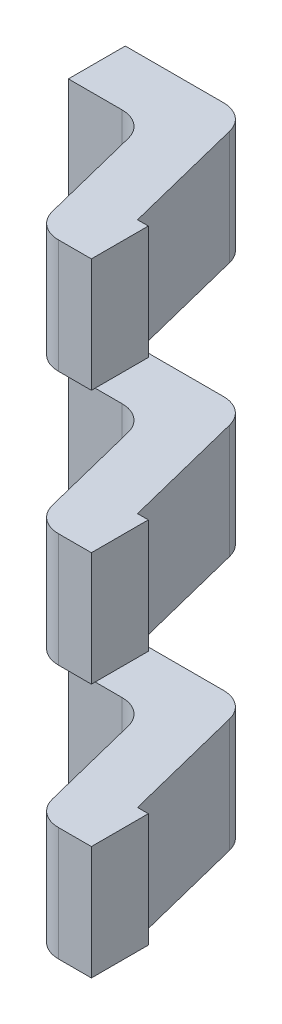
ISO-10303-21;
HEADER;
FILE_DESCRIPTION(('STEP AP214'),'2;1');
FILE_NAME('part.step','',(''),(''),'','','');
FILE_SCHEMA(('AUTOMOTIVE_DESIGN { 1 0 10303 214 1 1 1 1 }'));
ENDSEC;
DATA;
#1=APPLICATION_CONTEXT('core data for automotive mechanical design processes');
#2=APPLICATION_PROTOCOL_DEFINITION('international standard','automotive_design',2000,#1);
#3=PRODUCT_CONTEXT('',#1,'mechanical');
#4=PRODUCT('Part','Part','',(#3));
#5=PRODUCT_RELATED_PRODUCT_CATEGORY('part','',(#4));
#6=PRODUCT_DEFINITION_FORMATION('','',#4);
#7=PRODUCT_DEFINITION_CONTEXT('part definition',#1,'design');
#8=PRODUCT_DEFINITION('design','',#6,#7);
#9=PRODUCT_DEFINITION_SHAPE('','',#8);
#10=(LENGTH_UNIT() NAMED_UNIT(*) SI_UNIT(.MILLI.,.METRE.));
#11=(NAMED_UNIT(*) PLANE_ANGLE_UNIT() SI_UNIT($,.RADIAN.));
#12=(NAMED_UNIT(*) SI_UNIT($,.STERADIAN.) SOLID_ANGLE_UNIT());
#13=UNCERTAINTY_MEASURE_WITH_UNIT(LENGTH_MEASURE(1.E-05),#10,'distance_accuracy_value','');
#14=(GEOMETRIC_REPRESENTATION_CONTEXT(3) GLOBAL_UNCERTAINTY_ASSIGNED_CONTEXT((#13)) GLOBAL_UNIT_ASSIGNED_CONTEXT((#10,
#11,#12)) REPRESENTATION_CONTEXT('',''));
#15=CARTESIAN_POINT('',(0.,0.,0.));
#16=DIRECTION('',(0.,0.,1.));
#17=DIRECTION('',(1.,0.,0.));
#18=AXIS2_PLACEMENT_3D('',#15,#16,#17);
#19=CARTESIAN_POINT('',(-1.071722354756,0.2125,0.323542364223));
#20=DIRECTION('',(0.,1.,0.));
#21=DIRECTION('',(-1.,0.,0.));
#22=AXIS2_PLACEMENT_3D('',#19,#20,#21);
#23=PLANE('',#22);
#24=DIRECTION('',(-0.242535625036098,0.,-0.970142500145391));
#25=VECTOR('',#24,1.);
#26=CARTESIAN_POINT('',(-0.975,0.2125,0.));
#27=LINE('',#26,#25);
#28=CARTESIAN_POINT('',(-0.954879852540029,0.2125,0.0804805898399656));
#29=VERTEX_POINT('',#28);
#30=CARTESIAN_POINT('',(-0.840240294920043,0.2125,0.539038820320011));
#31=VERTEX_POINT('',#30);
#32=EDGE_CURVE('P0_E111',#29,#31,#27,.F.);
#33=ORIENTED_EDGE('',*,*,#32,.F.);
#34=CARTESIAN_POINT('',(-1.05795749318,0.2125,0.10625));
#35=DIRECTION('',(0.,1.,0.));
#36=DIRECTION('',(0.,0.,1.));
#37=AXIS2_PLACEMENT_3D('',#34,#35,#36);
#38=CIRCLE('',#37,0.10625);
#39=CARTESIAN_POINT('',(-1.05795749318,0.2125,0.));
#40=VERTEX_POINT('',#39);
#41=EDGE_CURVE('P0_E20',#40,#29,#38,.F.);
#42=ORIENTED_EDGE('',*,*,#41,.F.);
#43=DIRECTION('',(1.,0.,0.));
#44=VECTOR('',#43,1.);
#45=CARTESIAN_POINT('',(-1.425,0.2125,0.));
#46=LINE('',#45,#44);
#47=CARTESIAN_POINT('',(-1.425,0.2125,0.));
#48=VERTEX_POINT('',#47);
#49=EDGE_CURVE('P0_E97',#40,#48,#46,.F.);
#50=ORIENTED_EDGE('',*,*,#49,.T.);
#51=DIRECTION('',(0.,0.,-1.));
#52=VECTOR('',#51,1.);
#53=CARTESIAN_POINT('',(-1.425,0.2125,0.));
#54=LINE('',#53,#52);
#55=CARTESIAN_POINT('',(-1.425,0.2125,0.2125));
#56=VERTEX_POINT('',#55);
#57=EDGE_CURVE('P0_E129',#48,#56,#54,.F.);
#58=ORIENTED_EDGE('',*,*,#57,.T.);
#59=DIRECTION('',(1.,0.,0.));
#60=VECTOR('',#59,1.);
#61=CARTESIAN_POINT('',(-1.425,0.2125,0.2125));
#62=LINE('',#61,#60);
#63=CARTESIAN_POINT('',(-1.223872479541,0.2125,0.2125));
#64=VERTEX_POINT('',#63);
#65=EDGE_CURVE('P0_E133',#64,#56,#62,.F.);
#66=ORIENTED_EDGE('',*,*,#65,.F.);
#67=CARTESIAN_POINT('',(-1.223872479541,0.2125,0.31875));
#68=DIRECTION('',(0.,1.,0.));
#69=DIRECTION('',(0.,0.,1.));
#70=AXIS2_PLACEMENT_3D('',#67,#68,#69);
#71=CIRCLE('',#70,0.10625);
#72=CARTESIAN_POINT('',(-1.12079483890083,0.2125,0.292980589839971));
#73=VERTEX_POINT('',#72);
#74=EDGE_CURVE('P0_E176',#64,#73,#71,.F.);
#75=ORIENTED_EDGE('',*,*,#74,.T.);
#76=DIRECTION('',(-0.242535625036098,0.,-0.970142500145391));
#77=VECTOR('',#76,1.);
#78=CARTESIAN_POINT('',(-1.181155281281,0.2125,0.05153882032022));
#79=LINE('',#78,#77);
#80=CARTESIAN_POINT('',(-1.02627542874118,0.2125,0.671058230480156));
#81=VERTEX_POINT('',#80);
#82=EDGE_CURVE('P0_E144',#73,#81,#79,.F.);
#83=ORIENTED_EDGE('',*,*,#82,.T.);
#84=CARTESIAN_POINT('',(-0.9231977881,0.2125,0.64528882032));
#85=DIRECTION('',(0.,1.,0.));
#86=DIRECTION('',(0.,0.,1.));
#87=AXIS2_PLACEMENT_3D('',#84,#85,#86);
#88=CIRCLE('',#87,0.10625);
#89=CARTESIAN_POINT('',(-0.9231977881,0.2125,0.75153882032));
#90=VERTEX_POINT('',#89);
#91=EDGE_CURVE('P0_E147',#90,#81,#88,.F.);
#92=ORIENTED_EDGE('',*,*,#91,.F.);
#93=DIRECTION('',(1.,0.,0.));
#94=VECTOR('',#93,1.);
#95=CARTESIAN_POINT('',(-1.006155281281,0.2125,0.75153882032));
#96=LINE('',#95,#94);
#97=CARTESIAN_POINT('',(-0.8,0.2125,0.75153882032));
#98=VERTEX_POINT('',#97);
#99=EDGE_CURVE('P0_E148',#98,#90,#96,.F.);
#100=ORIENTED_EDGE('',*,*,#99,.F.);
#101=DIRECTION('',(0.,0.,-1.));
#102=VECTOR('',#101,1.);
#103=CARTESIAN_POINT('',(-0.8,0.2125,0.53903882032));
#104=LINE('',#103,#102);
#105=CARTESIAN_POINT('',(-0.8,0.2125,0.53903882032));
#106=VERTEX_POINT('',#105);
#107=EDGE_CURVE('P0_E154',#106,#98,#104,.F.);
#108=ORIENTED_EDGE('',*,*,#107,.F.);
#109=DIRECTION('',(1.,0.,0.));
#110=VECTOR('',#109,1.);
#111=CARTESIAN_POINT('',(-1.006155281281,0.2125,0.53903882032));
#112=LINE('',#111,#110);
#113=EDGE_CURVE('P0_E113',#106,#31,#112,.F.);
#114=ORIENTED_EDGE('',*,*,#113,.T.);
#115=EDGE_LOOP('',(#33,#42,#50,#58,#66,#75,#83,#92,#100,#108,#114));
#116=FACE_BOUND('',#115,.T.);
#117=ADVANCED_FACE('P0_F17',(#116),#23,.T.);
#118=CARTESIAN_POINT('',(-1.425,-0.2125,0.));
#119=DIRECTION('',(0.,0.,1.));
#120=DIRECTION('',(1.,0.,0.));
#121=AXIS2_PLACEMENT_3D('',#118,#119,#120);
#122=PLANE('',#121);
#123=DIRECTION('',(1.,0.,0.));
#124=VECTOR('',#123,1.);
#125=CARTESIAN_POINT('',(-1.071722354756,-0.2125,0.));
#126=LINE('',#125,#124);
#127=CARTESIAN_POINT('',(-1.425,-0.2125,0.));
#128=VERTEX_POINT('',#127);
#129=CARTESIAN_POINT('',(-1.05795749318,-0.2125,0.));
#130=VERTEX_POINT('',#129);
#131=EDGE_CURVE('P0_E175',#128,#130,#126,.T.);
#132=ORIENTED_EDGE('',*,*,#131,.F.);
#133=DIRECTION('',(0.,1.,0.));
#134=VECTOR('',#133,1.);
#135=CARTESIAN_POINT('',(-1.425,-0.2125,0.));
#136=LINE('',#135,#134);
#137=EDGE_CURVE('P0_E127',#128,#48,#136,.T.);
#138=ORIENTED_EDGE('',*,*,#137,.T.);
#139=ORIENTED_EDGE('',*,*,#49,.F.);
#140=DIRECTION('',(0.,1.,0.));
#141=VECTOR('',#140,1.);
#142=CARTESIAN_POINT('',(-1.05795749318,-0.2125,0.));
#143=LINE('',#142,#141);
#144=EDGE_CURVE('P0_E108',#130,#40,#143,.T.);
#145=ORIENTED_EDGE('',*,*,#144,.F.);
#146=EDGE_LOOP('',(#132,#138,#139,#145));
#147=FACE_BOUND('',#146,.T.);
#148=ADVANCED_FACE('P0_F343',(#147),#122,.F.);
#149=CARTESIAN_POINT('',(-1.05795749318,-0.2125,0.10625));
#150=DIRECTION('',(0.,1.,0.));
#151=DIRECTION('',(0.,0.,1.));
#152=AXIS2_PLACEMENT_3D('',#149,#150,#151);
#153=CYLINDRICAL_SURFACE('',#152,0.10625);
#154=DIRECTION('',(0.,1.,0.));
#155=VECTOR('',#154,1.);
#156=CARTESIAN_POINT('',(-0.954879852540045,-0.2125,0.0804805898399013));
#157=LINE('',#156,#155);
#158=CARTESIAN_POINT('',(-0.954879852540009,-0.2125,0.0804805898399503));
#159=VERTEX_POINT('',#158);
#160=EDGE_CURVE('P0_E106',#159,#29,#157,.T.);
#161=ORIENTED_EDGE('',*,*,#160,.F.);
#162=CARTESIAN_POINT('',(-1.05795749318,-0.2125,0.10625));
#163=DIRECTION('',(0.,1.,0.));
#164=DIRECTION('',(0.,0.,1.));
#165=AXIS2_PLACEMENT_3D('',#162,#163,#164);
#166=CIRCLE('',#165,0.10625);
#167=EDGE_CURVE('P0_E173',#130,#159,#166,.F.);
#168=ORIENTED_EDGE('',*,*,#167,.F.);
#169=ORIENTED_EDGE('',*,*,#144,.T.);
#170=ORIENTED_EDGE('',*,*,#41,.T.);
#171=EDGE_LOOP('',(#161,#168,#169,#170));
#172=FACE_BOUND('',#171,.T.);
#173=ADVANCED_FACE('P0_F103',(#172),#153,.T.);
#174=CARTESIAN_POINT('',(-0.975,-0.2125,0.));
#175=DIRECTION('',(0.970142500145391,0.,-0.242535625036098));
#176=DIRECTION('',(-0.242535625036098,0.,-0.970142500145391));
#177=AXIS2_PLACEMENT_3D('',#174,#175,#176);
#178=PLANE('',#177);
#179=ORIENTED_EDGE('',*,*,#32,.T.);
#180=DIRECTION('',(0.,1.,0.));
#181=VECTOR('',#180,1.);
#182=CARTESIAN_POINT('',(-0.84024029492,-0.2125,0.53903882032));
#183=LINE('',#182,#181);
#184=CARTESIAN_POINT('',(-0.84024029492,-0.2125,0.53903882032));
#185=VERTEX_POINT('',#184);
#186=EDGE_CURVE('P0_E160',#31,#185,#183,.F.);
#187=ORIENTED_EDGE('',*,*,#186,.T.);
#188=DIRECTION('',(0.242535625036278,0.,0.970142500145346));
#189=VECTOR('',#188,1.);
#190=CARTESIAN_POINT('',(-0.95487985254,-0.2125,0.08048058983989));
#191=LINE('',#190,#189);
#192=EDGE_CURVE('P0_E119',#159,#185,#191,.T.);
#193=ORIENTED_EDGE('',*,*,#192,.F.);
#194=ORIENTED_EDGE('',*,*,#160,.T.);
#195=EDGE_LOOP('',(#179,#187,#193,#194));
#196=FACE_BOUND('',#195,.T.);
#197=ADVANCED_FACE('P0_F117',(#196),#178,.T.);
#198=CARTESIAN_POINT('',(-1.006155281281,-0.2125,0.53903882032));
#199=DIRECTION('',(0.,0.,1.));
#200=DIRECTION('',(1.,0.,0.));
#201=AXIS2_PLACEMENT_3D('',#198,#199,#200);
#202=PLANE('',#201);
#203=DIRECTION('',(1.,0.,0.));
#204=VECTOR('',#203,1.);
#205=CARTESIAN_POINT('',(-1.071722354756,-0.2125,0.53903882032));
#206=LINE('',#205,#204);
#207=CARTESIAN_POINT('',(-0.8,-0.2125,0.53903882032));
#208=VERTEX_POINT('',#207);
#209=EDGE_CURVE('P0_E194',#185,#208,#206,.T.);
#210=ORIENTED_EDGE('',*,*,#209,.F.);
#211=ORIENTED_EDGE('',*,*,#186,.F.);
#212=ORIENTED_EDGE('',*,*,#113,.F.);
#213=DIRECTION('',(0.,1.,0.));
#214=VECTOR('',#213,1.);
#215=CARTESIAN_POINT('',(-0.8,-0.2125,0.53903882032));
#216=LINE('',#215,#214);
#217=EDGE_CURVE('P0_E156',#208,#106,#216,.T.);
#218=ORIENTED_EDGE('',*,*,#217,.F.);
#219=EDGE_LOOP('',(#210,#211,#212,#218));
#220=FACE_BOUND('',#219,.T.);
#221=ADVANCED_FACE('P0_F206',(#220),#202,.F.);
#222=CARTESIAN_POINT('',(-0.8,-0.2125,0.53903882032));
#223=DIRECTION('',(1.,0.,0.));
#224=DIRECTION('',(0.,0.,-1.));
#225=AXIS2_PLACEMENT_3D('',#222,#223,#224);
#226=PLANE('',#225);
#227=ORIENTED_EDGE('',*,*,#107,.T.);
#228=DIRECTION('',(0.,1.,0.));
#229=VECTOR('',#228,1.);
#230=CARTESIAN_POINT('',(-0.8,-0.2125,0.75153882032));
#231=LINE('',#230,#229);
#232=CARTESIAN_POINT('',(-0.8,-0.2125,0.75153882032));
#233=VERTEX_POINT('',#232);
#234=EDGE_CURVE('P0_E151',#233,#98,#231,.T.);
#235=ORIENTED_EDGE('',*,*,#234,.F.);
#236=DIRECTION('',(0.,0.,-1.));
#237=VECTOR('',#236,1.);
#238=CARTESIAN_POINT('',(-0.8,-0.2125,0.323542364223));
#239=LINE('',#238,#237);
#240=EDGE_CURVE('P0_E191',#208,#233,#239,.F.);
#241=ORIENTED_EDGE('',*,*,#240,.F.);
#242=ORIENTED_EDGE('',*,*,#217,.T.);
#243=EDGE_LOOP('',(#227,#235,#241,#242));
#244=FACE_BOUND('',#243,.T.);
#245=ADVANCED_FACE('P0_F256',(#244),#226,.T.);
#246=CARTESIAN_POINT('',(-1.006155281281,-0.2125,0.75153882032));
#247=DIRECTION('',(0.,0.,1.));
#248=DIRECTION('',(1.,0.,0.));
#249=AXIS2_PLACEMENT_3D('',#246,#247,#248);
#250=PLANE('',#249);
#251=ORIENTED_EDGE('',*,*,#99,.T.);
#252=DIRECTION('',(0.,1.,0.));
#253=VECTOR('',#252,1.);
#254=CARTESIAN_POINT('',(-0.9231977881,-0.2125,0.75153882032));
#255=LINE('',#254,#253);
#256=CARTESIAN_POINT('',(-0.9231977881,-0.2125,0.75153882032));
#257=VERTEX_POINT('',#256);
#258=EDGE_CURVE('P0_E150',#257,#90,#255,.T.);
#259=ORIENTED_EDGE('',*,*,#258,.F.);
#260=DIRECTION('',(1.,0.,0.));
#261=VECTOR('',#260,1.);
#262=CARTESIAN_POINT('',(-1.071722354756,-0.2125,0.75153882032));
#263=LINE('',#262,#261);
#264=EDGE_CURVE('P0_E172',#233,#257,#263,.F.);
#265=ORIENTED_EDGE('',*,*,#264,.F.);
#266=ORIENTED_EDGE('',*,*,#234,.T.);
#267=EDGE_LOOP('',(#251,#259,#265,#266));
#268=FACE_BOUND('',#267,.T.);
#269=ADVANCED_FACE('P0_F245',(#268),#250,.T.);
#270=CARTESIAN_POINT('',(-0.9231977881,-0.2125,0.64528882032));
#271=DIRECTION('',(0.,1.,0.));
#272=DIRECTION('',(0.,0.,1.));
#273=AXIS2_PLACEMENT_3D('',#270,#271,#272);
#274=CYLINDRICAL_SURFACE('',#273,0.10625);
#275=ORIENTED_EDGE('',*,*,#91,.T.);
#276=DIRECTION('',(0.,1.,0.));
#277=VECTOR('',#276,1.);
#278=CARTESIAN_POINT('',(-1.0262754287412,-0.2125,0.671058230480051));
#279=LINE('',#278,#277);
#280=CARTESIAN_POINT('',(-1.02627542874107,-0.2125,0.671058230480143));
#281=VERTEX_POINT('',#280);
#282=EDGE_CURVE('P0_E146',#81,#281,#279,.F.);
#283=ORIENTED_EDGE('',*,*,#282,.T.);
#284=CARTESIAN_POINT('',(-0.9231977881,-0.2125,0.64528882032));
#285=DIRECTION('',(0.,1.,0.));
#286=DIRECTION('',(0.,0.,1.));
#287=AXIS2_PLACEMENT_3D('',#284,#285,#286);
#288=CIRCLE('',#287,0.10625);
#289=EDGE_CURVE('P0_E169',#257,#281,#288,.F.);
#290=ORIENTED_EDGE('',*,*,#289,.F.);
#291=ORIENTED_EDGE('',*,*,#258,.T.);
#292=EDGE_LOOP('',(#275,#283,#290,#291));
#293=FACE_BOUND('',#292,.T.);
#294=ADVANCED_FACE('P0_F247',(#293),#274,.T.);
#295=CARTESIAN_POINT('',(-1.181155281281,-0.2125,0.05153882032022));
#296=DIRECTION('',(0.970142500145391,0.,-0.242535625036098));
#297=DIRECTION('',(-0.242535625036098,0.,-0.970142500145391));
#298=AXIS2_PLACEMENT_3D('',#295,#296,#297);
#299=PLANE('',#298);
#300=ORIENTED_EDGE('',*,*,#82,.F.);
#301=DIRECTION('',(0.,1.,0.));
#302=VECTOR('',#301,1.);
#303=CARTESIAN_POINT('',(-1.12079483890056,-0.2125,0.29298058983989));
#304=LINE('',#303,#302);
#305=CARTESIAN_POINT('',(-1.12079483890078,-0.2125,0.292980589839945));
#306=VERTEX_POINT('',#305);
#307=EDGE_CURVE('P0_E135',#73,#306,#304,.F.);
#308=ORIENTED_EDGE('',*,*,#307,.T.);
#309=DIRECTION('',(-0.242535625036333,0.,-0.970142500145332));
#310=VECTOR('',#309,1.);
#311=CARTESIAN_POINT('',(-1.026275428741,-0.2125,0.67105823048));
#312=LINE('',#311,#310);
#313=EDGE_CURVE('P0_E168',#281,#306,#312,.T.);
#314=ORIENTED_EDGE('',*,*,#313,.F.);
#315=ORIENTED_EDGE('',*,*,#282,.F.);
#316=EDGE_LOOP('',(#300,#308,#314,#315));
#317=FACE_BOUND('',#316,.T.);
#318=ADVANCED_FACE('P0_F233',(#317),#299,.F.);
#319=CARTESIAN_POINT('',(-1.223872479541,-0.2125,0.31875));
#320=DIRECTION('',(0.,1.,0.));
#321=DIRECTION('',(0.,0.,1.));
#322=AXIS2_PLACEMENT_3D('',#319,#320,#321);
#323=CYLINDRICAL_SURFACE('',#322,0.10625);
#324=ORIENTED_EDGE('',*,*,#307,.F.);
#325=ORIENTED_EDGE('',*,*,#74,.F.);
#326=DIRECTION('',(0.,1.,0.));
#327=VECTOR('',#326,1.);
#328=CARTESIAN_POINT('',(-1.223872479541,-0.2125,0.2125));
#329=LINE('',#328,#327);
#330=CARTESIAN_POINT('',(-1.223872479541,-0.2125,0.2125));
#331=VERTEX_POINT('',#330);
#332=EDGE_CURVE('P0_E130',#331,#64,#329,.T.);
#333=ORIENTED_EDGE('',*,*,#332,.F.);
#334=CARTESIAN_POINT('',(-1.223872479541,-0.2125,0.31875));
#335=DIRECTION('',(0.,1.,0.));
#336=DIRECTION('',(0.,0.,1.));
#337=AXIS2_PLACEMENT_3D('',#334,#335,#336);
#338=CIRCLE('',#337,0.10625);
#339=EDGE_CURVE('P0_E165',#306,#331,#338,.T.);
#340=ORIENTED_EDGE('',*,*,#339,.F.);
#341=EDGE_LOOP('',(#324,#325,#333,#340));
#342=FACE_BOUND('',#341,.T.);
#343=ADVANCED_FACE('P0_F237',(#342),#323,.F.);
#344=CARTESIAN_POINT('',(-1.425,-0.2125,0.2125));
#345=DIRECTION('',(0.,0.,1.));
#346=DIRECTION('',(1.,0.,0.));
#347=AXIS2_PLACEMENT_3D('',#344,#345,#346);
#348=PLANE('',#347);
#349=DIRECTION('',(1.,0.,0.));
#350=VECTOR('',#349,1.);
#351=CARTESIAN_POINT('',(-1.071722354756,-0.2125,0.2125));
#352=LINE('',#351,#350);
#353=CARTESIAN_POINT('',(-1.425,-0.2125,0.2125));
#354=VERTEX_POINT('',#353);
#355=EDGE_CURVE('P0_E26',#331,#354,#352,.F.);
#356=ORIENTED_EDGE('',*,*,#355,.F.);
#357=ORIENTED_EDGE('',*,*,#332,.T.);
#358=ORIENTED_EDGE('',*,*,#65,.T.);
#359=DIRECTION('',(0.,1.,0.));
#360=VECTOR('',#359,1.);
#361=CARTESIAN_POINT('',(-1.425,-0.2125,0.2125));
#362=LINE('',#361,#360);
#363=EDGE_CURVE('P0_E35',#56,#354,#362,.F.);
#364=ORIENTED_EDGE('',*,*,#363,.T.);
#365=EDGE_LOOP('',(#356,#357,#358,#364));
#366=FACE_BOUND('',#365,.T.);
#367=ADVANCED_FACE('P0_F264',(#366),#348,.T.);
#368=CARTESIAN_POINT('',(-1.425,-0.2125,0.));
#369=DIRECTION('',(1.,0.,0.));
#370=DIRECTION('',(0.,0.,-1.));
#371=AXIS2_PLACEMENT_3D('',#368,#369,#370);
#372=PLANE('',#371);
#373=ORIENTED_EDGE('',*,*,#57,.F.);
#374=ORIENTED_EDGE('',*,*,#137,.F.);
#375=DIRECTION('',(0.,0.,-1.));
#376=VECTOR('',#375,1.);
#377=CARTESIAN_POINT('',(-1.425,-0.2125,0.323542364223));
#378=LINE('',#377,#376);
#379=EDGE_CURVE('P0_E11',#354,#128,#378,.T.);
#380=ORIENTED_EDGE('',*,*,#379,.F.);
#381=ORIENTED_EDGE('',*,*,#363,.F.);
#382=EDGE_LOOP('',(#373,#374,#380,#381));
#383=FACE_BOUND('',#382,.T.);
#384=ADVANCED_FACE('P0_F259',(#383),#372,.F.);
#385=CARTESIAN_POINT('',(-1.071722354756,-0.2125,0.323542364223));
#386=DIRECTION('',(0.,-1.,0.));
#387=DIRECTION('',(0.,0.,-1.));
#388=AXIS2_PLACEMENT_3D('',#385,#386,#387);
#389=PLANE('',#388);
#390=ORIENTED_EDGE('',*,*,#355,.T.);
#391=ORIENTED_EDGE('',*,*,#379,.T.);
#392=ORIENTED_EDGE('',*,*,#131,.T.);
#393=ORIENTED_EDGE('',*,*,#167,.T.);
#394=ORIENTED_EDGE('',*,*,#192,.T.);
#395=ORIENTED_EDGE('',*,*,#209,.T.);
#396=ORIENTED_EDGE('',*,*,#240,.T.);
#397=ORIENTED_EDGE('',*,*,#264,.T.);
#398=ORIENTED_EDGE('',*,*,#289,.T.);
#399=ORIENTED_EDGE('',*,*,#313,.T.);
#400=ORIENTED_EDGE('',*,*,#339,.T.);
#401=EDGE_LOOP('',(#390,#391,#392,#393,#394,#395,#396,#397,#398,#399,#400));
#402=FACE_BOUND('',#401,.T.);
#403=ADVANCED_FACE('P0_F210',(#402),#389,.T.);
#404=CLOSED_SHELL('',(#117,#148,#173,#197,#221,#245,#269,#294,#318,#343,#367,#384,#403));
#405=MANIFOLD_SOLID_BREP('P0_B1',#404);
#406=CARTESIAN_POINT('',(-1.071722354756,1.1625,0.323542364223));
#407=DIRECTION('',(0.,1.,0.));
#408=DIRECTION('',(-1.,0.,0.));
#409=AXIS2_PLACEMENT_3D('',#406,#407,#408);
#410=PLANE('',#409);
#411=DIRECTION('',(-0.242535625036098,0.,-0.970142500145391));
#412=VECTOR('',#411,1.);
#413=CARTESIAN_POINT('',(-0.975,1.1625,0.));
#414=LINE('',#413,#412);
#415=CARTESIAN_POINT('',(-0.954879852540029,1.1625,0.0804805898399656));
#416=VERTEX_POINT('',#415);
#417=CARTESIAN_POINT('',(-0.840240294920043,1.1625,0.539038820320011));
#418=VERTEX_POINT('',#417);
#419=EDGE_CURVE('P1_E111',#416,#418,#414,.F.);
#420=ORIENTED_EDGE('',*,*,#419,.F.);
#421=CARTESIAN_POINT('',(-1.05795749318,1.1625,0.10625));
#422=DIRECTION('',(0.,1.,0.));
#423=DIRECTION('',(0.,0.,1.));
#424=AXIS2_PLACEMENT_3D('',#421,#422,#423);
#425=CIRCLE('',#424,0.10625);
#426=CARTESIAN_POINT('',(-1.05795749318,1.1625,0.));
#427=VERTEX_POINT('',#426);
#428=EDGE_CURVE('P1_E20',#427,#416,#425,.F.);
#429=ORIENTED_EDGE('',*,*,#428,.F.);
#430=DIRECTION('',(1.,0.,0.));
#431=VECTOR('',#430,1.);
#432=CARTESIAN_POINT('',(-1.425,1.1625,0.));
#433=LINE('',#432,#431);
#434=CARTESIAN_POINT('',(-1.425,1.1625,0.));
#435=VERTEX_POINT('',#434);
#436=EDGE_CURVE('P1_E97',#427,#435,#433,.F.);
#437=ORIENTED_EDGE('',*,*,#436,.T.);
#438=DIRECTION('',(0.,0.,-1.));
#439=VECTOR('',#438,1.);
#440=CARTESIAN_POINT('',(-1.425,1.1625,0.));
#441=LINE('',#440,#439);
#442=CARTESIAN_POINT('',(-1.425,1.1625,0.2125));
#443=VERTEX_POINT('',#442);
#444=EDGE_CURVE('P1_E129',#435,#443,#441,.F.);
#445=ORIENTED_EDGE('',*,*,#444,.T.);
#446=DIRECTION('',(1.,0.,0.));
#447=VECTOR('',#446,1.);
#448=CARTESIAN_POINT('',(-1.425,1.1625,0.2125));
#449=LINE('',#448,#447);
#450=CARTESIAN_POINT('',(-1.223872479541,1.1625,0.2125));
#451=VERTEX_POINT('',#450);
#452=EDGE_CURVE('P1_E133',#451,#443,#449,.F.);
#453=ORIENTED_EDGE('',*,*,#452,.F.);
#454=CARTESIAN_POINT('',(-1.223872479541,1.1625,0.31875));
#455=DIRECTION('',(0.,1.,0.));
#456=DIRECTION('',(0.,0.,1.));
#457=AXIS2_PLACEMENT_3D('',#454,#455,#456);
#458=CIRCLE('',#457,0.10625);
#459=CARTESIAN_POINT('',(-1.12079483890083,1.1625,0.292980589839971));
#460=VERTEX_POINT('',#459);
#461=EDGE_CURVE('P1_E176',#451,#460,#458,.F.);
#462=ORIENTED_EDGE('',*,*,#461,.T.);
#463=DIRECTION('',(-0.242535625036098,0.,-0.970142500145391));
#464=VECTOR('',#463,1.);
#465=CARTESIAN_POINT('',(-1.181155281281,1.1625,0.05153882032022));
#466=LINE('',#465,#464);
#467=CARTESIAN_POINT('',(-1.02627542874118,1.1625,0.671058230480156));
#468=VERTEX_POINT('',#467);
#469=EDGE_CURVE('P1_E144',#460,#468,#466,.F.);
#470=ORIENTED_EDGE('',*,*,#469,.T.);
#471=CARTESIAN_POINT('',(-0.9231977881,1.1625,0.64528882032));
#472=DIRECTION('',(0.,1.,0.));
#473=DIRECTION('',(0.,0.,1.));
#474=AXIS2_PLACEMENT_3D('',#471,#472,#473);
#475=CIRCLE('',#474,0.10625);
#476=CARTESIAN_POINT('',(-0.9231977881,1.1625,0.75153882032));
#477=VERTEX_POINT('',#476);
#478=EDGE_CURVE('P1_E147',#477,#468,#475,.F.);
#479=ORIENTED_EDGE('',*,*,#478,.F.);
#480=DIRECTION('',(1.,0.,0.));
#481=VECTOR('',#480,1.);
#482=CARTESIAN_POINT('',(-1.006155281281,1.1625,0.75153882032));
#483=LINE('',#482,#481);
#484=CARTESIAN_POINT('',(-0.8,1.1625,0.75153882032));
#485=VERTEX_POINT('',#484);
#486=EDGE_CURVE('P1_E148',#485,#477,#483,.F.);
#487=ORIENTED_EDGE('',*,*,#486,.F.);
#488=DIRECTION('',(0.,0.,-1.));
#489=VECTOR('',#488,1.);
#490=CARTESIAN_POINT('',(-0.8,1.1625,0.53903882032));
#491=LINE('',#490,#489);
#492=CARTESIAN_POINT('',(-0.8,1.1625,0.53903882032));
#493=VERTEX_POINT('',#492);
#494=EDGE_CURVE('P1_E154',#493,#485,#491,.F.);
#495=ORIENTED_EDGE('',*,*,#494,.F.);
#496=DIRECTION('',(1.,0.,0.));
#497=VECTOR('',#496,1.);
#498=CARTESIAN_POINT('',(-1.006155281281,1.1625,0.53903882032));
#499=LINE('',#498,#497);
#500=EDGE_CURVE('P1_E113',#493,#418,#499,.F.);
#501=ORIENTED_EDGE('',*,*,#500,.T.);
#502=EDGE_LOOP('',(#420,#429,#437,#445,#453,#462,#470,#479,#487,#495,#501));
#503=FACE_BOUND('',#502,.T.);
#504=ADVANCED_FACE('P1_F17',(#503),#410,.T.);
#505=CARTESIAN_POINT('',(-1.425,0.7375,0.));
#506=DIRECTION('',(0.,0.,1.));
#507=DIRECTION('',(1.,0.,0.));
#508=AXIS2_PLACEMENT_3D('',#505,#506,#507);
#509=PLANE('',#508);
#510=DIRECTION('',(1.,0.,0.));
#511=VECTOR('',#510,1.);
#512=CARTESIAN_POINT('',(-1.071722354756,0.7375,0.));
#513=LINE('',#512,#511);
#514=CARTESIAN_POINT('',(-1.425,0.7375,0.));
#515=VERTEX_POINT('',#514);
#516=CARTESIAN_POINT('',(-1.05795749318,0.7375,0.));
#517=VERTEX_POINT('',#516);
#518=EDGE_CURVE('P1_E175',#515,#517,#513,.T.);
#519=ORIENTED_EDGE('',*,*,#518,.F.);
#520=DIRECTION('',(0.,1.,0.));
#521=VECTOR('',#520,1.);
#522=CARTESIAN_POINT('',(-1.425,0.7375,0.));
#523=LINE('',#522,#521);
#524=EDGE_CURVE('P1_E127',#515,#435,#523,.T.);
#525=ORIENTED_EDGE('',*,*,#524,.T.);
#526=ORIENTED_EDGE('',*,*,#436,.F.);
#527=DIRECTION('',(0.,1.,0.));
#528=VECTOR('',#527,1.);
#529=CARTESIAN_POINT('',(-1.05795749318,0.7375,0.));
#530=LINE('',#529,#528);
#531=EDGE_CURVE('P1_E108',#517,#427,#530,.T.);
#532=ORIENTED_EDGE('',*,*,#531,.F.);
#533=EDGE_LOOP('',(#519,#525,#526,#532));
#534=FACE_BOUND('',#533,.T.);
#535=ADVANCED_FACE('P1_F343',(#534),#509,.F.);
#536=CARTESIAN_POINT('',(-1.05795749318,0.7375,0.10625));
#537=DIRECTION('',(0.,1.,0.));
#538=DIRECTION('',(0.,0.,1.));
#539=AXIS2_PLACEMENT_3D('',#536,#537,#538);
#540=CYLINDRICAL_SURFACE('',#539,0.10625);
#541=DIRECTION('',(0.,1.,0.));
#542=VECTOR('',#541,1.);
#543=CARTESIAN_POINT('',(-0.954879852540045,0.7375,0.0804805898399013));
#544=LINE('',#543,#542);
#545=CARTESIAN_POINT('',(-0.954879852540009,0.7375,0.0804805898399503));
#546=VERTEX_POINT('',#545);
#547=EDGE_CURVE('P1_E106',#546,#416,#544,.T.);
#548=ORIENTED_EDGE('',*,*,#547,.F.);
#549=CARTESIAN_POINT('',(-1.05795749318,0.7375,0.10625));
#550=DIRECTION('',(0.,1.,0.));
#551=DIRECTION('',(0.,0.,1.));
#552=AXIS2_PLACEMENT_3D('',#549,#550,#551);
#553=CIRCLE('',#552,0.10625);
#554=EDGE_CURVE('P1_E173',#517,#546,#553,.F.);
#555=ORIENTED_EDGE('',*,*,#554,.F.);
#556=ORIENTED_EDGE('',*,*,#531,.T.);
#557=ORIENTED_EDGE('',*,*,#428,.T.);
#558=EDGE_LOOP('',(#548,#555,#556,#557));
#559=FACE_BOUND('',#558,.T.);
#560=ADVANCED_FACE('P1_F103',(#559),#540,.T.);
#561=CARTESIAN_POINT('',(-0.975,0.7375,0.));
#562=DIRECTION('',(0.970142500145391,0.,-0.242535625036098));
#563=DIRECTION('',(-0.242535625036098,0.,-0.970142500145391));
#564=AXIS2_PLACEMENT_3D('',#561,#562,#563);
#565=PLANE('',#564);
#566=ORIENTED_EDGE('',*,*,#419,.T.);
#567=DIRECTION('',(0.,1.,0.));
#568=VECTOR('',#567,1.);
#569=CARTESIAN_POINT('',(-0.84024029492,0.7375,0.53903882032));
#570=LINE('',#569,#568);
#571=CARTESIAN_POINT('',(-0.84024029492,0.7375,0.53903882032));
#572=VERTEX_POINT('',#571);
#573=EDGE_CURVE('P1_E160',#418,#572,#570,.F.);
#574=ORIENTED_EDGE('',*,*,#573,.T.);
#575=DIRECTION('',(0.242535625036278,0.,0.970142500145346));
#576=VECTOR('',#575,1.);
#577=CARTESIAN_POINT('',(-0.95487985254,0.7375,0.08048058983989));
#578=LINE('',#577,#576);
#579=EDGE_CURVE('P1_E119',#546,#572,#578,.T.);
#580=ORIENTED_EDGE('',*,*,#579,.F.);
#581=ORIENTED_EDGE('',*,*,#547,.T.);
#582=EDGE_LOOP('',(#566,#574,#580,#581));
#583=FACE_BOUND('',#582,.T.);
#584=ADVANCED_FACE('P1_F117',(#583),#565,.T.);
#585=CARTESIAN_POINT('',(-1.006155281281,0.7375,0.53903882032));
#586=DIRECTION('',(0.,0.,1.));
#587=DIRECTION('',(1.,0.,0.));
#588=AXIS2_PLACEMENT_3D('',#585,#586,#587);
#589=PLANE('',#588);
#590=DIRECTION('',(1.,0.,0.));
#591=VECTOR('',#590,1.);
#592=CARTESIAN_POINT('',(-1.071722354756,0.7375,0.53903882032));
#593=LINE('',#592,#591);
#594=CARTESIAN_POINT('',(-0.8,0.7375,0.53903882032));
#595=VERTEX_POINT('',#594);
#596=EDGE_CURVE('P1_E194',#572,#595,#593,.T.);
#597=ORIENTED_EDGE('',*,*,#596,.F.);
#598=ORIENTED_EDGE('',*,*,#573,.F.);
#599=ORIENTED_EDGE('',*,*,#500,.F.);
#600=DIRECTION('',(0.,1.,0.));
#601=VECTOR('',#600,1.);
#602=CARTESIAN_POINT('',(-0.8,0.7375,0.53903882032));
#603=LINE('',#602,#601);
#604=EDGE_CURVE('P1_E156',#595,#493,#603,.T.);
#605=ORIENTED_EDGE('',*,*,#604,.F.);
#606=EDGE_LOOP('',(#597,#598,#599,#605));
#607=FACE_BOUND('',#606,.T.);
#608=ADVANCED_FACE('P1_F206',(#607),#589,.F.);
#609=CARTESIAN_POINT('',(-0.8,0.7375,0.53903882032));
#610=DIRECTION('',(1.,0.,0.));
#611=DIRECTION('',(0.,0.,-1.));
#612=AXIS2_PLACEMENT_3D('',#609,#610,#611);
#613=PLANE('',#612);
#614=ORIENTED_EDGE('',*,*,#494,.T.);
#615=DIRECTION('',(0.,1.,0.));
#616=VECTOR('',#615,1.);
#617=CARTESIAN_POINT('',(-0.8,0.7375,0.75153882032));
#618=LINE('',#617,#616);
#619=CARTESIAN_POINT('',(-0.8,0.7375,0.75153882032));
#620=VERTEX_POINT('',#619);
#621=EDGE_CURVE('P1_E151',#620,#485,#618,.T.);
#622=ORIENTED_EDGE('',*,*,#621,.F.);
#623=DIRECTION('',(0.,0.,-1.));
#624=VECTOR('',#623,1.);
#625=CARTESIAN_POINT('',(-0.8,0.7375,0.323542364223));
#626=LINE('',#625,#624);
#627=EDGE_CURVE('P1_E191',#595,#620,#626,.F.);
#628=ORIENTED_EDGE('',*,*,#627,.F.);
#629=ORIENTED_EDGE('',*,*,#604,.T.);
#630=EDGE_LOOP('',(#614,#622,#628,#629));
#631=FACE_BOUND('',#630,.T.);
#632=ADVANCED_FACE('P1_F256',(#631),#613,.T.);
#633=CARTESIAN_POINT('',(-1.006155281281,0.7375,0.75153882032));
#634=DIRECTION('',(0.,0.,1.));
#635=DIRECTION('',(1.,0.,0.));
#636=AXIS2_PLACEMENT_3D('',#633,#634,#635);
#637=PLANE('',#636);
#638=ORIENTED_EDGE('',*,*,#486,.T.);
#639=DIRECTION('',(0.,1.,0.));
#640=VECTOR('',#639,1.);
#641=CARTESIAN_POINT('',(-0.9231977881,0.7375,0.75153882032));
#642=LINE('',#641,#640);
#643=CARTESIAN_POINT('',(-0.9231977881,0.7375,0.75153882032));
#644=VERTEX_POINT('',#643);
#645=EDGE_CURVE('P1_E150',#644,#477,#642,.T.);
#646=ORIENTED_EDGE('',*,*,#645,.F.);
#647=DIRECTION('',(1.,0.,0.));
#648=VECTOR('',#647,1.);
#649=CARTESIAN_POINT('',(-1.071722354756,0.7375,0.75153882032));
#650=LINE('',#649,#648);
#651=EDGE_CURVE('P1_E172',#620,#644,#650,.F.);
#652=ORIENTED_EDGE('',*,*,#651,.F.);
#653=ORIENTED_EDGE('',*,*,#621,.T.);
#654=EDGE_LOOP('',(#638,#646,#652,#653));
#655=FACE_BOUND('',#654,.T.);
#656=ADVANCED_FACE('P1_F245',(#655),#637,.T.);
#657=CARTESIAN_POINT('',(-0.9231977881,0.7375,0.64528882032));
#658=DIRECTION('',(0.,1.,0.));
#659=DIRECTION('',(0.,0.,1.));
#660=AXIS2_PLACEMENT_3D('',#657,#658,#659);
#661=CYLINDRICAL_SURFACE('',#660,0.10625);
#662=ORIENTED_EDGE('',*,*,#478,.T.);
#663=DIRECTION('',(0.,1.,0.));
#664=VECTOR('',#663,1.);
#665=CARTESIAN_POINT('',(-1.0262754287412,0.7375,0.671058230480051));
#666=LINE('',#665,#664);
#667=CARTESIAN_POINT('',(-1.02627542874107,0.7375,0.671058230480143));
#668=VERTEX_POINT('',#667);
#669=EDGE_CURVE('P1_E146',#468,#668,#666,.F.);
#670=ORIENTED_EDGE('',*,*,#669,.T.);
#671=CARTESIAN_POINT('',(-0.9231977881,0.7375,0.64528882032));
#672=DIRECTION('',(0.,1.,0.));
#673=DIRECTION('',(0.,0.,1.));
#674=AXIS2_PLACEMENT_3D('',#671,#672,#673);
#675=CIRCLE('',#674,0.10625);
#676=EDGE_CURVE('P1_E169',#644,#668,#675,.F.);
#677=ORIENTED_EDGE('',*,*,#676,.F.);
#678=ORIENTED_EDGE('',*,*,#645,.T.);
#679=EDGE_LOOP('',(#662,#670,#677,#678));
#680=FACE_BOUND('',#679,.T.);
#681=ADVANCED_FACE('P1_F247',(#680),#661,.T.);
#682=CARTESIAN_POINT('',(-1.181155281281,0.7375,0.05153882032022));
#683=DIRECTION('',(0.970142500145391,0.,-0.242535625036098));
#684=DIRECTION('',(-0.242535625036098,0.,-0.970142500145391));
#685=AXIS2_PLACEMENT_3D('',#682,#683,#684);
#686=PLANE('',#685);
#687=ORIENTED_EDGE('',*,*,#469,.F.);
#688=DIRECTION('',(0.,1.,0.));
#689=VECTOR('',#688,1.);
#690=CARTESIAN_POINT('',(-1.12079483890056,0.7375,0.29298058983989));
#691=LINE('',#690,#689);
#692=CARTESIAN_POINT('',(-1.12079483890078,0.7375,0.292980589839945));
#693=VERTEX_POINT('',#692);
#694=EDGE_CURVE('P1_E135',#460,#693,#691,.F.);
#695=ORIENTED_EDGE('',*,*,#694,.T.);
#696=DIRECTION('',(-0.242535625036333,0.,-0.970142500145332));
#697=VECTOR('',#696,1.);
#698=CARTESIAN_POINT('',(-1.026275428741,0.7375,0.67105823048));
#699=LINE('',#698,#697);
#700=EDGE_CURVE('P1_E168',#668,#693,#699,.T.);
#701=ORIENTED_EDGE('',*,*,#700,.F.);
#702=ORIENTED_EDGE('',*,*,#669,.F.);
#703=EDGE_LOOP('',(#687,#695,#701,#702));
#704=FACE_BOUND('',#703,.T.);
#705=ADVANCED_FACE('P1_F233',(#704),#686,.F.);
#706=CARTESIAN_POINT('',(-1.223872479541,0.7375,0.31875));
#707=DIRECTION('',(0.,1.,0.));
#708=DIRECTION('',(0.,0.,1.));
#709=AXIS2_PLACEMENT_3D('',#706,#707,#708);
#710=CYLINDRICAL_SURFACE('',#709,0.10625);
#711=ORIENTED_EDGE('',*,*,#694,.F.);
#712=ORIENTED_EDGE('',*,*,#461,.F.);
#713=DIRECTION('',(0.,1.,0.));
#714=VECTOR('',#713,1.);
#715=CARTESIAN_POINT('',(-1.223872479541,0.7375,0.2125));
#716=LINE('',#715,#714);
#717=CARTESIAN_POINT('',(-1.223872479541,0.7375,0.2125));
#718=VERTEX_POINT('',#717);
#719=EDGE_CURVE('P1_E130',#718,#451,#716,.T.);
#720=ORIENTED_EDGE('',*,*,#719,.F.);
#721=CARTESIAN_POINT('',(-1.223872479541,0.7375,0.31875));
#722=DIRECTION('',(0.,1.,0.));
#723=DIRECTION('',(0.,0.,1.));
#724=AXIS2_PLACEMENT_3D('',#721,#722,#723);
#725=CIRCLE('',#724,0.10625);
#726=EDGE_CURVE('P1_E165',#693,#718,#725,.T.);
#727=ORIENTED_EDGE('',*,*,#726,.F.);
#728=EDGE_LOOP('',(#711,#712,#720,#727));
#729=FACE_BOUND('',#728,.T.);
#730=ADVANCED_FACE('P1_F237',(#729),#710,.F.);
#731=CARTESIAN_POINT('',(-1.425,0.7375,0.2125));
#732=DIRECTION('',(0.,0.,1.));
#733=DIRECTION('',(1.,0.,0.));
#734=AXIS2_PLACEMENT_3D('',#731,#732,#733);
#735=PLANE('',#734);
#736=DIRECTION('',(1.,0.,0.));
#737=VECTOR('',#736,1.);
#738=CARTESIAN_POINT('',(-1.071722354756,0.7375,0.2125));
#739=LINE('',#738,#737);
#740=CARTESIAN_POINT('',(-1.425,0.7375,0.2125));
#741=VERTEX_POINT('',#740);
#742=EDGE_CURVE('P1_E26',#718,#741,#739,.F.);
#743=ORIENTED_EDGE('',*,*,#742,.F.);
#744=ORIENTED_EDGE('',*,*,#719,.T.);
#745=ORIENTED_EDGE('',*,*,#452,.T.);
#746=DIRECTION('',(0.,1.,0.));
#747=VECTOR('',#746,1.);
#748=CARTESIAN_POINT('',(-1.425,0.7375,0.2125));
#749=LINE('',#748,#747);
#750=EDGE_CURVE('P1_E35',#443,#741,#749,.F.);
#751=ORIENTED_EDGE('',*,*,#750,.T.);
#752=EDGE_LOOP('',(#743,#744,#745,#751));
#753=FACE_BOUND('',#752,.T.);
#754=ADVANCED_FACE('P1_F264',(#753),#735,.T.);
#755=CARTESIAN_POINT('',(-1.425,0.7375,0.));
#756=DIRECTION('',(1.,0.,0.));
#757=DIRECTION('',(0.,0.,-1.));
#758=AXIS2_PLACEMENT_3D('',#755,#756,#757);
#759=PLANE('',#758);
#760=ORIENTED_EDGE('',*,*,#444,.F.);
#761=ORIENTED_EDGE('',*,*,#524,.F.);
#762=DIRECTION('',(0.,0.,-1.));
#763=VECTOR('',#762,1.);
#764=CARTESIAN_POINT('',(-1.425,0.7375,0.323542364223));
#765=LINE('',#764,#763);
#766=EDGE_CURVE('P1_E11',#741,#515,#765,.T.);
#767=ORIENTED_EDGE('',*,*,#766,.F.);
#768=ORIENTED_EDGE('',*,*,#750,.F.);
#769=EDGE_LOOP('',(#760,#761,#767,#768));
#770=FACE_BOUND('',#769,.T.);
#771=ADVANCED_FACE('P1_F259',(#770),#759,.F.);
#772=CARTESIAN_POINT('',(-1.071722354756,0.7375,0.323542364223));
#773=DIRECTION('',(0.,-1.,0.));
#774=DIRECTION('',(0.,0.,-1.));
#775=AXIS2_PLACEMENT_3D('',#772,#773,#774);
#776=PLANE('',#775);
#777=ORIENTED_EDGE('',*,*,#742,.T.);
#778=ORIENTED_EDGE('',*,*,#766,.T.);
#779=ORIENTED_EDGE('',*,*,#518,.T.);
#780=ORIENTED_EDGE('',*,*,#554,.T.);
#781=ORIENTED_EDGE('',*,*,#579,.T.);
#782=ORIENTED_EDGE('',*,*,#596,.T.);
#783=ORIENTED_EDGE('',*,*,#627,.T.);
#784=ORIENTED_EDGE('',*,*,#651,.T.);
#785=ORIENTED_EDGE('',*,*,#676,.T.);
#786=ORIENTED_EDGE('',*,*,#700,.T.);
#787=ORIENTED_EDGE('',*,*,#726,.T.);
#788=EDGE_LOOP('',(#777,#778,#779,#780,#781,#782,#783,#784,#785,#786,#787));
#789=FACE_BOUND('',#788,.T.);
#790=ADVANCED_FACE('P1_F210',(#789),#776,.T.);
#791=CLOSED_SHELL('',(#504,#535,#560,#584,#608,#632,#656,#681,#705,#730,#754,#771,#790));
#792=MANIFOLD_SOLID_BREP('P1_B1',#791);
#793=CARTESIAN_POINT('',(-1.071722354756,-0.7375,0.323542364223));
#794=DIRECTION('',(0.,1.,0.));
#795=DIRECTION('',(-1.,0.,0.));
#796=AXIS2_PLACEMENT_3D('',#793,#794,#795);
#797=PLANE('',#796);
#798=DIRECTION('',(-0.242535625036098,0.,-0.970142500145391));
#799=VECTOR('',#798,1.);
#800=CARTESIAN_POINT('',(-0.975,-0.7375,0.));
#801=LINE('',#800,#799);
#802=CARTESIAN_POINT('',(-0.954879852540029,-0.7375,0.0804805898399656));
#803=VERTEX_POINT('',#802);
#804=CARTESIAN_POINT('',(-0.840240294920043,-0.7375,0.539038820320011));
#805=VERTEX_POINT('',#804);
#806=EDGE_CURVE('P2_E111',#803,#805,#801,.F.);
#807=ORIENTED_EDGE('',*,*,#806,.F.);
#808=CARTESIAN_POINT('',(-1.05795749318,-0.7375,0.10625));
#809=DIRECTION('',(0.,1.,0.));
#810=DIRECTION('',(0.,0.,1.));
#811=AXIS2_PLACEMENT_3D('',#808,#809,#810);
#812=CIRCLE('',#811,0.10625);
#813=CARTESIAN_POINT('',(-1.05795749318,-0.7375,0.));
#814=VERTEX_POINT('',#813);
#815=EDGE_CURVE('P2_E20',#814,#803,#812,.F.);
#816=ORIENTED_EDGE('',*,*,#815,.F.);
#817=DIRECTION('',(1.,0.,0.));
#818=VECTOR('',#817,1.);
#819=CARTESIAN_POINT('',(-1.425,-0.7375,0.));
#820=LINE('',#819,#818);
#821=CARTESIAN_POINT('',(-1.425,-0.7375,0.));
#822=VERTEX_POINT('',#821);
#823=EDGE_CURVE('P2_E97',#814,#822,#820,.F.);
#824=ORIENTED_EDGE('',*,*,#823,.T.);
#825=DIRECTION('',(0.,0.,-1.));
#826=VECTOR('',#825,1.);
#827=CARTESIAN_POINT('',(-1.425,-0.7375,0.));
#828=LINE('',#827,#826);
#829=CARTESIAN_POINT('',(-1.425,-0.7375,0.2125));
#830=VERTEX_POINT('',#829);
#831=EDGE_CURVE('P2_E129',#822,#830,#828,.F.);
#832=ORIENTED_EDGE('',*,*,#831,.T.);
#833=DIRECTION('',(1.,0.,0.));
#834=VECTOR('',#833,1.);
#835=CARTESIAN_POINT('',(-1.425,-0.7375,0.2125));
#836=LINE('',#835,#834);
#837=CARTESIAN_POINT('',(-1.223872479541,-0.7375,0.2125));
#838=VERTEX_POINT('',#837);
#839=EDGE_CURVE('P2_E133',#838,#830,#836,.F.);
#840=ORIENTED_EDGE('',*,*,#839,.F.);
#841=CARTESIAN_POINT('',(-1.223872479541,-0.7375,0.31875));
#842=DIRECTION('',(0.,1.,0.));
#843=DIRECTION('',(0.,0.,1.));
#844=AXIS2_PLACEMENT_3D('',#841,#842,#843);
#845=CIRCLE('',#844,0.10625);
#846=CARTESIAN_POINT('',(-1.12079483890083,-0.7375,0.292980589839971));
#847=VERTEX_POINT('',#846);
#848=EDGE_CURVE('P2_E176',#838,#847,#845,.F.);
#849=ORIENTED_EDGE('',*,*,#848,.T.);
#850=DIRECTION('',(-0.242535625036098,0.,-0.970142500145391));
#851=VECTOR('',#850,1.);
#852=CARTESIAN_POINT('',(-1.181155281281,-0.7375,0.05153882032022));
#853=LINE('',#852,#851);
#854=CARTESIAN_POINT('',(-1.02627542874118,-0.7375,0.671058230480156));
#855=VERTEX_POINT('',#854);
#856=EDGE_CURVE('P2_E144',#847,#855,#853,.F.);
#857=ORIENTED_EDGE('',*,*,#856,.T.);
#858=CARTESIAN_POINT('',(-0.9231977881,-0.7375,0.64528882032));
#859=DIRECTION('',(0.,1.,0.));
#860=DIRECTION('',(0.,0.,1.));
#861=AXIS2_PLACEMENT_3D('',#858,#859,#860);
#862=CIRCLE('',#861,0.10625);
#863=CARTESIAN_POINT('',(-0.9231977881,-0.7375,0.75153882032));
#864=VERTEX_POINT('',#863);
#865=EDGE_CURVE('P2_E147',#864,#855,#862,.F.);
#866=ORIENTED_EDGE('',*,*,#865,.F.);
#867=DIRECTION('',(1.,0.,0.));
#868=VECTOR('',#867,1.);
#869=CARTESIAN_POINT('',(-1.006155281281,-0.7375,0.75153882032));
#870=LINE('',#869,#868);
#871=CARTESIAN_POINT('',(-0.8,-0.7375,0.75153882032));
#872=VERTEX_POINT('',#871);
#873=EDGE_CURVE('P2_E148',#872,#864,#870,.F.);
#874=ORIENTED_EDGE('',*,*,#873,.F.);
#875=DIRECTION('',(0.,0.,-1.));
#876=VECTOR('',#875,1.);
#877=CARTESIAN_POINT('',(-0.8,-0.7375,0.53903882032));
#878=LINE('',#877,#876);
#879=CARTESIAN_POINT('',(-0.8,-0.7375,0.53903882032));
#880=VERTEX_POINT('',#879);
#881=EDGE_CURVE('P2_E154',#880,#872,#878,.F.);
#882=ORIENTED_EDGE('',*,*,#881,.F.);
#883=DIRECTION('',(1.,0.,0.));
#884=VECTOR('',#883,1.);
#885=CARTESIAN_POINT('',(-1.006155281281,-0.7375,0.53903882032));
#886=LINE('',#885,#884);
#887=EDGE_CURVE('P2_E113',#880,#805,#886,.F.);
#888=ORIENTED_EDGE('',*,*,#887,.T.);
#889=EDGE_LOOP('',(#807,#816,#824,#832,#840,#849,#857,#866,#874,#882,#888));
#890=FACE_BOUND('',#889,.T.);
#891=ADVANCED_FACE('P2_F17',(#890),#797,.T.);
#892=CARTESIAN_POINT('',(-1.425,-1.1625,0.));
#893=DIRECTION('',(0.,0.,1.));
#894=DIRECTION('',(1.,0.,0.));
#895=AXIS2_PLACEMENT_3D('',#892,#893,#894);
#896=PLANE('',#895);
#897=DIRECTION('',(1.,0.,0.));
#898=VECTOR('',#897,1.);
#899=CARTESIAN_POINT('',(-1.071722354756,-1.1625,0.));
#900=LINE('',#899,#898);
#901=CARTESIAN_POINT('',(-1.425,-1.1625,0.));
#902=VERTEX_POINT('',#901);
#903=CARTESIAN_POINT('',(-1.05795749318,-1.1625,0.));
#904=VERTEX_POINT('',#903);
#905=EDGE_CURVE('P2_E175',#902,#904,#900,.T.);
#906=ORIENTED_EDGE('',*,*,#905,.F.);
#907=DIRECTION('',(0.,1.,0.));
#908=VECTOR('',#907,1.);
#909=CARTESIAN_POINT('',(-1.425,-1.1625,0.));
#910=LINE('',#909,#908);
#911=EDGE_CURVE('P2_E127',#902,#822,#910,.T.);
#912=ORIENTED_EDGE('',*,*,#911,.T.);
#913=ORIENTED_EDGE('',*,*,#823,.F.);
#914=DIRECTION('',(0.,1.,0.));
#915=VECTOR('',#914,1.);
#916=CARTESIAN_POINT('',(-1.05795749318,-1.1625,0.));
#917=LINE('',#916,#915);
#918=EDGE_CURVE('P2_E108',#904,#814,#917,.T.);
#919=ORIENTED_EDGE('',*,*,#918,.F.);
#920=EDGE_LOOP('',(#906,#912,#913,#919));
#921=FACE_BOUND('',#920,.T.);
#922=ADVANCED_FACE('P2_F343',(#921),#896,.F.);
#923=CARTESIAN_POINT('',(-1.05795749318,-1.1625,0.10625));
#924=DIRECTION('',(0.,1.,0.));
#925=DIRECTION('',(0.,0.,1.));
#926=AXIS2_PLACEMENT_3D('',#923,#924,#925);
#927=CYLINDRICAL_SURFACE('',#926,0.10625);
#928=DIRECTION('',(0.,1.,0.));
#929=VECTOR('',#928,1.);
#930=CARTESIAN_POINT('',(-0.954879852540045,-1.1625,0.0804805898399013));
#931=LINE('',#930,#929);
#932=CARTESIAN_POINT('',(-0.954879852540009,-1.1625,0.0804805898399503));
#933=VERTEX_POINT('',#932);
#934=EDGE_CURVE('P2_E106',#933,#803,#931,.T.);
#935=ORIENTED_EDGE('',*,*,#934,.F.);
#936=CARTESIAN_POINT('',(-1.05795749318,-1.1625,0.10625));
#937=DIRECTION('',(0.,1.,0.));
#938=DIRECTION('',(0.,0.,1.));
#939=AXIS2_PLACEMENT_3D('',#936,#937,#938);
#940=CIRCLE('',#939,0.10625);
#941=EDGE_CURVE('P2_E173',#904,#933,#940,.F.);
#942=ORIENTED_EDGE('',*,*,#941,.F.);
#943=ORIENTED_EDGE('',*,*,#918,.T.);
#944=ORIENTED_EDGE('',*,*,#815,.T.);
#945=EDGE_LOOP('',(#935,#942,#943,#944));
#946=FACE_BOUND('',#945,.T.);
#947=ADVANCED_FACE('P2_F103',(#946),#927,.T.);
#948=CARTESIAN_POINT('',(-0.975,-1.1625,0.));
#949=DIRECTION('',(0.970142500145391,0.,-0.242535625036098));
#950=DIRECTION('',(-0.242535625036098,0.,-0.970142500145391));
#951=AXIS2_PLACEMENT_3D('',#948,#949,#950);
#952=PLANE('',#951);
#953=ORIENTED_EDGE('',*,*,#806,.T.);
#954=DIRECTION('',(0.,1.,0.));
#955=VECTOR('',#954,1.);
#956=CARTESIAN_POINT('',(-0.84024029492,-1.1625,0.53903882032));
#957=LINE('',#956,#955);
#958=CARTESIAN_POINT('',(-0.84024029492,-1.1625,0.53903882032));
#959=VERTEX_POINT('',#958);
#960=EDGE_CURVE('P2_E160',#805,#959,#957,.F.);
#961=ORIENTED_EDGE('',*,*,#960,.T.);
#962=DIRECTION('',(0.242535625036278,0.,0.970142500145346));
#963=VECTOR('',#962,1.);
#964=CARTESIAN_POINT('',(-0.95487985254,-1.1625,0.08048058983989));
#965=LINE('',#964,#963);
#966=EDGE_CURVE('P2_E119',#933,#959,#965,.T.);
#967=ORIENTED_EDGE('',*,*,#966,.F.);
#968=ORIENTED_EDGE('',*,*,#934,.T.);
#969=EDGE_LOOP('',(#953,#961,#967,#968));
#970=FACE_BOUND('',#969,.T.);
#971=ADVANCED_FACE('P2_F117',(#970),#952,.T.);
#972=CARTESIAN_POINT('',(-1.006155281281,-1.1625,0.53903882032));
#973=DIRECTION('',(0.,0.,1.));
#974=DIRECTION('',(1.,0.,0.));
#975=AXIS2_PLACEMENT_3D('',#972,#973,#974);
#976=PLANE('',#975);
#977=DIRECTION('',(1.,0.,0.));
#978=VECTOR('',#977,1.);
#979=CARTESIAN_POINT('',(-1.071722354756,-1.1625,0.53903882032));
#980=LINE('',#979,#978);
#981=CARTESIAN_POINT('',(-0.8,-1.1625,0.53903882032));
#982=VERTEX_POINT('',#981);
#983=EDGE_CURVE('P2_E194',#959,#982,#980,.T.);
#984=ORIENTED_EDGE('',*,*,#983,.F.);
#985=ORIENTED_EDGE('',*,*,#960,.F.);
#986=ORIENTED_EDGE('',*,*,#887,.F.);
#987=DIRECTION('',(0.,1.,0.));
#988=VECTOR('',#987,1.);
#989=CARTESIAN_POINT('',(-0.8,-1.1625,0.53903882032));
#990=LINE('',#989,#988);
#991=EDGE_CURVE('P2_E156',#982,#880,#990,.T.);
#992=ORIENTED_EDGE('',*,*,#991,.F.);
#993=EDGE_LOOP('',(#984,#985,#986,#992));
#994=FACE_BOUND('',#993,.T.);
#995=ADVANCED_FACE('P2_F206',(#994),#976,.F.);
#996=CARTESIAN_POINT('',(-0.8,-1.1625,0.53903882032));
#997=DIRECTION('',(1.,0.,0.));
#998=DIRECTION('',(0.,0.,-1.));
#999=AXIS2_PLACEMENT_3D('',#996,#997,#998);
#1000=PLANE('',#999);
#1001=ORIENTED_EDGE('',*,*,#881,.T.);
#1002=DIRECTION('',(0.,1.,0.));
#1003=VECTOR('',#1002,1.);
#1004=CARTESIAN_POINT('',(-0.8,-1.1625,0.75153882032));
#1005=LINE('',#1004,#1003);
#1006=CARTESIAN_POINT('',(-0.8,-1.1625,0.75153882032));
#1007=VERTEX_POINT('',#1006);
#1008=EDGE_CURVE('P2_E151',#1007,#872,#1005,.T.);
#1009=ORIENTED_EDGE('',*,*,#1008,.F.);
#1010=DIRECTION('',(0.,0.,-1.));
#1011=VECTOR('',#1010,1.);
#1012=CARTESIAN_POINT('',(-0.8,-1.1625,0.323542364223));
#1013=LINE('',#1012,#1011);
#1014=EDGE_CURVE('P2_E191',#982,#1007,#1013,.F.);
#1015=ORIENTED_EDGE('',*,*,#1014,.F.);
#1016=ORIENTED_EDGE('',*,*,#991,.T.);
#1017=EDGE_LOOP('',(#1001,#1009,#1015,#1016));
#1018=FACE_BOUND('',#1017,.T.);
#1019=ADVANCED_FACE('P2_F256',(#1018),#1000,.T.);
#1020=CARTESIAN_POINT('',(-1.006155281281,-1.1625,0.75153882032));
#1021=DIRECTION('',(0.,0.,1.));
#1022=DIRECTION('',(1.,0.,0.));
#1023=AXIS2_PLACEMENT_3D('',#1020,#1021,#1022);
#1024=PLANE('',#1023);
#1025=ORIENTED_EDGE('',*,*,#873,.T.);
#1026=DIRECTION('',(0.,1.,0.));
#1027=VECTOR('',#1026,1.);
#1028=CARTESIAN_POINT('',(-0.9231977881,-1.1625,0.75153882032));
#1029=LINE('',#1028,#1027);
#1030=CARTESIAN_POINT('',(-0.9231977881,-1.1625,0.75153882032));
#1031=VERTEX_POINT('',#1030);
#1032=EDGE_CURVE('P2_E150',#1031,#864,#1029,.T.);
#1033=ORIENTED_EDGE('',*,*,#1032,.F.);
#1034=DIRECTION('',(1.,0.,0.));
#1035=VECTOR('',#1034,1.);
#1036=CARTESIAN_POINT('',(-1.071722354756,-1.1625,0.75153882032));
#1037=LINE('',#1036,#1035);
#1038=EDGE_CURVE('P2_E172',#1007,#1031,#1037,.F.);
#1039=ORIENTED_EDGE('',*,*,#1038,.F.);
#1040=ORIENTED_EDGE('',*,*,#1008,.T.);
#1041=EDGE_LOOP('',(#1025,#1033,#1039,#1040));
#1042=FACE_BOUND('',#1041,.T.);
#1043=ADVANCED_FACE('P2_F245',(#1042),#1024,.T.);
#1044=CARTESIAN_POINT('',(-0.9231977881,-1.1625,0.64528882032));
#1045=DIRECTION('',(0.,1.,0.));
#1046=DIRECTION('',(0.,0.,1.));
#1047=AXIS2_PLACEMENT_3D('',#1044,#1045,#1046);
#1048=CYLINDRICAL_SURFACE('',#1047,0.10625);
#1049=ORIENTED_EDGE('',*,*,#865,.T.);
#1050=DIRECTION('',(0.,1.,0.));
#1051=VECTOR('',#1050,1.);
#1052=CARTESIAN_POINT('',(-1.0262754287412,-1.1625,0.671058230480051));
#1053=LINE('',#1052,#1051);
#1054=CARTESIAN_POINT('',(-1.02627542874107,-1.1625,0.671058230480143));
#1055=VERTEX_POINT('',#1054);
#1056=EDGE_CURVE('P2_E146',#855,#1055,#1053,.F.);
#1057=ORIENTED_EDGE('',*,*,#1056,.T.);
#1058=CARTESIAN_POINT('',(-0.9231977881,-1.1625,0.64528882032));
#1059=DIRECTION('',(0.,1.,0.));
#1060=DIRECTION('',(0.,0.,1.));
#1061=AXIS2_PLACEMENT_3D('',#1058,#1059,#1060);
#1062=CIRCLE('',#1061,0.10625);
#1063=EDGE_CURVE('P2_E169',#1031,#1055,#1062,.F.);
#1064=ORIENTED_EDGE('',*,*,#1063,.F.);
#1065=ORIENTED_EDGE('',*,*,#1032,.T.);
#1066=EDGE_LOOP('',(#1049,#1057,#1064,#1065));
#1067=FACE_BOUND('',#1066,.T.);
#1068=ADVANCED_FACE('P2_F247',(#1067),#1048,.T.);
#1069=CARTESIAN_POINT('',(-1.181155281281,-1.1625,0.05153882032022));
#1070=DIRECTION('',(0.970142500145391,0.,-0.242535625036098));
#1071=DIRECTION('',(-0.242535625036098,0.,-0.970142500145391));
#1072=AXIS2_PLACEMENT_3D('',#1069,#1070,#1071);
#1073=PLANE('',#1072);
#1074=ORIENTED_EDGE('',*,*,#856,.F.);
#1075=DIRECTION('',(0.,1.,0.));
#1076=VECTOR('',#1075,1.);
#1077=CARTESIAN_POINT('',(-1.12079483890056,-1.1625,0.29298058983989));
#1078=LINE('',#1077,#1076);
#1079=CARTESIAN_POINT('',(-1.12079483890078,-1.1625,0.292980589839945));
#1080=VERTEX_POINT('',#1079);
#1081=EDGE_CURVE('P2_E135',#847,#1080,#1078,.F.);
#1082=ORIENTED_EDGE('',*,*,#1081,.T.);
#1083=DIRECTION('',(-0.242535625036333,0.,-0.970142500145332));
#1084=VECTOR('',#1083,1.);
#1085=CARTESIAN_POINT('',(-1.026275428741,-1.1625,0.67105823048));
#1086=LINE('',#1085,#1084);
#1087=EDGE_CURVE('P2_E168',#1055,#1080,#1086,.T.);
#1088=ORIENTED_EDGE('',*,*,#1087,.F.);
#1089=ORIENTED_EDGE('',*,*,#1056,.F.);
#1090=EDGE_LOOP('',(#1074,#1082,#1088,#1089));
#1091=FACE_BOUND('',#1090,.T.);
#1092=ADVANCED_FACE('P2_F233',(#1091),#1073,.F.);
#1093=CARTESIAN_POINT('',(-1.223872479541,-1.1625,0.31875));
#1094=DIRECTION('',(0.,1.,0.));
#1095=DIRECTION('',(0.,0.,1.));
#1096=AXIS2_PLACEMENT_3D('',#1093,#1094,#1095);
#1097=CYLINDRICAL_SURFACE('',#1096,0.10625);
#1098=ORIENTED_EDGE('',*,*,#1081,.F.);
#1099=ORIENTED_EDGE('',*,*,#848,.F.);
#1100=DIRECTION('',(0.,1.,0.));
#1101=VECTOR('',#1100,1.);
#1102=CARTESIAN_POINT('',(-1.223872479541,-1.1625,0.2125));
#1103=LINE('',#1102,#1101);
#1104=CARTESIAN_POINT('',(-1.223872479541,-1.1625,0.2125));
#1105=VERTEX_POINT('',#1104);
#1106=EDGE_CURVE('P2_E130',#1105,#838,#1103,.T.);
#1107=ORIENTED_EDGE('',*,*,#1106,.F.);
#1108=CARTESIAN_POINT('',(-1.223872479541,-1.1625,0.31875));
#1109=DIRECTION('',(0.,1.,0.));
#1110=DIRECTION('',(0.,0.,1.));
#1111=AXIS2_PLACEMENT_3D('',#1108,#1109,#1110);
#1112=CIRCLE('',#1111,0.10625);
#1113=EDGE_CURVE('P2_E165',#1080,#1105,#1112,.T.);
#1114=ORIENTED_EDGE('',*,*,#1113,.F.);
#1115=EDGE_LOOP('',(#1098,#1099,#1107,#1114));
#1116=FACE_BOUND('',#1115,.T.);
#1117=ADVANCED_FACE('P2_F237',(#1116),#1097,.F.);
#1118=CARTESIAN_POINT('',(-1.425,-1.1625,0.2125));
#1119=DIRECTION('',(0.,0.,1.));
#1120=DIRECTION('',(1.,0.,0.));
#1121=AXIS2_PLACEMENT_3D('',#1118,#1119,#1120);
#1122=PLANE('',#1121);
#1123=DIRECTION('',(1.,0.,0.));
#1124=VECTOR('',#1123,1.);
#1125=CARTESIAN_POINT('',(-1.071722354756,-1.1625,0.2125));
#1126=LINE('',#1125,#1124);
#1127=CARTESIAN_POINT('',(-1.425,-1.1625,0.2125));
#1128=VERTEX_POINT('',#1127);
#1129=EDGE_CURVE('P2_E26',#1105,#1128,#1126,.F.);
#1130=ORIENTED_EDGE('',*,*,#1129,.F.);
#1131=ORIENTED_EDGE('',*,*,#1106,.T.);
#1132=ORIENTED_EDGE('',*,*,#839,.T.);
#1133=DIRECTION('',(0.,1.,0.));
#1134=VECTOR('',#1133,1.);
#1135=CARTESIAN_POINT('',(-1.425,-1.1625,0.2125));
#1136=LINE('',#1135,#1134);
#1137=EDGE_CURVE('P2_E35',#830,#1128,#1136,.F.);
#1138=ORIENTED_EDGE('',*,*,#1137,.T.);
#1139=EDGE_LOOP('',(#1130,#1131,#1132,#1138));
#1140=FACE_BOUND('',#1139,.T.);
#1141=ADVANCED_FACE('P2_F264',(#1140),#1122,.T.);
#1142=CARTESIAN_POINT('',(-1.425,-1.1625,0.));
#1143=DIRECTION('',(1.,0.,0.));
#1144=DIRECTION('',(0.,0.,-1.));
#1145=AXIS2_PLACEMENT_3D('',#1142,#1143,#1144);
#1146=PLANE('',#1145);
#1147=ORIENTED_EDGE('',*,*,#831,.F.);
#1148=ORIENTED_EDGE('',*,*,#911,.F.);
#1149=DIRECTION('',(0.,0.,-1.));
#1150=VECTOR('',#1149,1.);
#1151=CARTESIAN_POINT('',(-1.425,-1.1625,0.323542364223));
#1152=LINE('',#1151,#1150);
#1153=EDGE_CURVE('P2_E11',#1128,#902,#1152,.T.);
#1154=ORIENTED_EDGE('',*,*,#1153,.F.);
#1155=ORIENTED_EDGE('',*,*,#1137,.F.);
#1156=EDGE_LOOP('',(#1147,#1148,#1154,#1155));
#1157=FACE_BOUND('',#1156,.T.);
#1158=ADVANCED_FACE('P2_F259',(#1157),#1146,.F.);
#1159=CARTESIAN_POINT('',(-1.071722354756,-1.1625,0.323542364223));
#1160=DIRECTION('',(0.,-1.,0.));
#1161=DIRECTION('',(0.,0.,-1.));
#1162=AXIS2_PLACEMENT_3D('',#1159,#1160,#1161);
#1163=PLANE('',#1162);
#1164=ORIENTED_EDGE('',*,*,#1129,.T.);
#1165=ORIENTED_EDGE('',*,*,#1153,.T.);
#1166=ORIENTED_EDGE('',*,*,#905,.T.);
#1167=ORIENTED_EDGE('',*,*,#941,.T.);
#1168=ORIENTED_EDGE('',*,*,#966,.T.);
#1169=ORIENTED_EDGE('',*,*,#983,.T.);
#1170=ORIENTED_EDGE('',*,*,#1014,.T.);
#1171=ORIENTED_EDGE('',*,*,#1038,.T.);
#1172=ORIENTED_EDGE('',*,*,#1063,.T.);
#1173=ORIENTED_EDGE('',*,*,#1087,.T.);
#1174=ORIENTED_EDGE('',*,*,#1113,.T.);
#1175=EDGE_LOOP('',(#1164,#1165,#1166,#1167,#1168,#1169,#1170,#1171,#1172,#1173,#1174));
#1176=FACE_BOUND('',#1175,.T.);
#1177=ADVANCED_FACE('P2_F210',(#1176),#1163,.T.);
#1178=CLOSED_SHELL('',(#891,#922,#947,#971,#995,#1019,#1043,#1068,#1092,#1117,#1141,#1158,#1177));
#1179=MANIFOLD_SOLID_BREP('P2_B1',#1178);
#1180=ADVANCED_BREP_SHAPE_REPRESENTATION('',(#18,#405,#792,#1179),#14);
#1181=SHAPE_DEFINITION_REPRESENTATION(#9,#1180);
ENDSEC;
END-ISO-10303-21;
